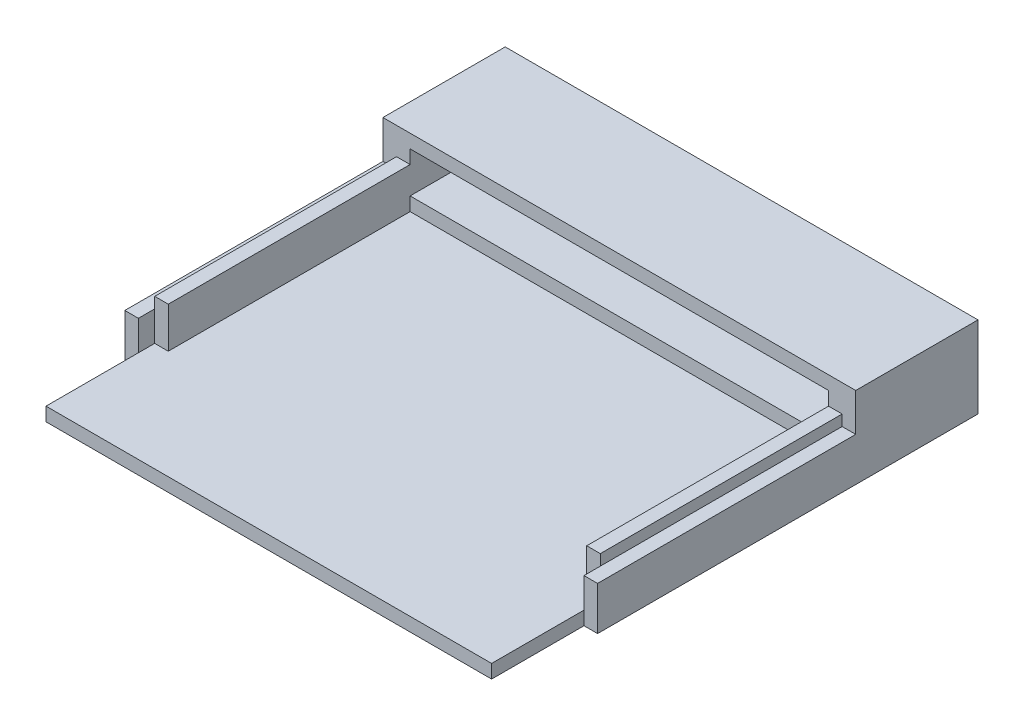
ISO-10303-21;
HEADER;
FILE_DESCRIPTION(('STEP AP214'),'2;1');
FILE_NAME('part.step','',(''),(''),'','','');
FILE_SCHEMA(('AUTOMOTIVE_DESIGN { 1 0 10303 214 1 1 1 1 }'));
ENDSEC;
DATA;
#1=APPLICATION_CONTEXT('core data for automotive mechanical design processes');
#2=APPLICATION_PROTOCOL_DEFINITION('international standard','automotive_design',2000,#1);
#3=PRODUCT_CONTEXT('',#1,'mechanical');
#4=PRODUCT('Part','Part','',(#3));
#5=PRODUCT_RELATED_PRODUCT_CATEGORY('part','',(#4));
#6=PRODUCT_DEFINITION_FORMATION('','',#4);
#7=PRODUCT_DEFINITION_CONTEXT('part definition',#1,'design');
#8=PRODUCT_DEFINITION('design','',#6,#7);
#9=PRODUCT_DEFINITION_SHAPE('','',#8);
#10=(LENGTH_UNIT() NAMED_UNIT(*) SI_UNIT(.MILLI.,.METRE.));
#11=(NAMED_UNIT(*) PLANE_ANGLE_UNIT() SI_UNIT($,.RADIAN.));
#12=(NAMED_UNIT(*) SI_UNIT($,.STERADIAN.) SOLID_ANGLE_UNIT());
#13=UNCERTAINTY_MEASURE_WITH_UNIT(LENGTH_MEASURE(1.E-05),#10,'distance_accuracy_value','');
#14=(GEOMETRIC_REPRESENTATION_CONTEXT(3) GLOBAL_UNCERTAINTY_ASSIGNED_CONTEXT((#13)) GLOBAL_UNIT_ASSIGNED_CONTEXT((#10,
#11,#12)) REPRESENTATION_CONTEXT('',''));
#15=CARTESIAN_POINT('',(0.,0.,0.));
#16=DIRECTION('',(0.,0.,1.));
#17=DIRECTION('',(1.,0.,0.));
#18=AXIS2_PLACEMENT_3D('',#15,#16,#17);
#19=CARTESIAN_POINT('',(159.,-5.,0.));
#20=DIRECTION('',(1.,0.,0.));
#21=DIRECTION('',(0.,0.,-1.));
#22=AXIS2_PLACEMENT_3D('',#19,#20,#21);
#23=PLANE('',#22);
#24=DIRECTION('',(0.,-1.,0.));
#25=VECTOR('',#24,1.);
#26=CARTESIAN_POINT('',(159.,11.,11.));
#27=LINE('',#26,#25);
#28=CARTESIAN_POINT('',(159.,0.,11.));
#29=VERTEX_POINT('',#28);
#30=CARTESIAN_POINT('',(159.,-5.,11.));
#31=VERTEX_POINT('',#30);
#32=EDGE_CURVE('E12',#29,#31,#27,.T.);
#33=ORIENTED_EDGE('',*,*,#32,.F.);
#34=DIRECTION('',(0.,0.,1.));
#35=VECTOR('',#34,1.);
#36=CARTESIAN_POINT('',(159.,0.,5.));
#37=LINE('',#36,#35);
#38=CARTESIAN_POINT('',(159.,0.,45.));
#39=VERTEX_POINT('',#38);
#40=EDGE_CURVE('E375',#29,#39,#37,.T.);
#41=ORIENTED_EDGE('',*,*,#40,.T.);
#42=DIRECTION('',(0.,1.,0.));
#43=VECTOR('',#42,1.);
#44=CARTESIAN_POINT('',(159.,0.,45.));
#45=LINE('',#44,#43);
#46=CARTESIAN_POINT('',(159.,-5.,45.));
#47=VERTEX_POINT('',#46);
#48=EDGE_CURVE('E240',#47,#39,#45,.T.);
#49=ORIENTED_EDGE('',*,*,#48,.F.);
#50=DIRECTION('',(0.,0.,-1.));
#51=VECTOR('',#50,1.);
#52=CARTESIAN_POINT('',(159.,-5.,0.));
#53=LINE('',#52,#51);
#54=EDGE_CURVE('E81',#47,#31,#53,.T.);
#55=ORIENTED_EDGE('',*,*,#54,.T.);
#56=EDGE_LOOP('',(#33,#41,#49,#55));
#57=FACE_BOUND('',#56,.T.);
#58=ADVANCED_FACE('F63',(#57),#23,.T.);
#59=CARTESIAN_POINT('',(-5.,-5.,0.));
#60=DIRECTION('',(1.,0.,0.));
#61=DIRECTION('',(0.,0.,-1.));
#62=AXIS2_PLACEMENT_3D('',#59,#60,#61);
#63=PLANE('',#62);
#64=DIRECTION('',(0.,0.,1.));
#65=VECTOR('',#64,1.);
#66=CARTESIAN_POINT('',(-5.,15.,0.));
#67=LINE('',#66,#65);
#68=CARTESIAN_POINT('',(-5.,15.,-84.));
#69=VERTEX_POINT('',#68);
#70=CARTESIAN_POINT('',(-5.,15.,5.));
#71=VERTEX_POINT('',#70);
#72=EDGE_CURVE('E364',#69,#71,#67,.T.);
#73=ORIENTED_EDGE('',*,*,#72,.F.);
#74=DIRECTION('',(0.,1.,0.));
#75=VECTOR('',#74,1.);
#76=CARTESIAN_POINT('',(-5.,3.92893218813452,-84.));
#77=LINE('',#76,#75);
#78=CARTESIAN_POINT('',(-5.,11.,-84.));
#79=VERTEX_POINT('',#78);
#80=EDGE_CURVE('E310',#79,#69,#77,.T.);
#81=ORIENTED_EDGE('',*,*,#80,.F.);
#82=DIRECTION('',(0.,0.,1.));
#83=VECTOR('',#82,1.);
#84=CARTESIAN_POINT('',(-5.,11.,-89.));
#85=LINE('',#84,#83);
#86=CARTESIAN_POINT('',(-5.,11.,5.));
#87=VERTEX_POINT('',#86);
#88=EDGE_CURVE('E341',#79,#87,#85,.T.);
#89=ORIENTED_EDGE('',*,*,#88,.T.);
#90=DIRECTION('',(0.,1.,0.));
#91=VECTOR('',#90,1.);
#92=CARTESIAN_POINT('',(-5.,-5.,5.));
#93=LINE('',#92,#91);
#94=EDGE_CURVE('E404',#87,#71,#93,.T.);
#95=ORIENTED_EDGE('',*,*,#94,.T.);
#96=EDGE_LOOP('',(#73,#81,#89,#95));
#97=FACE_BOUND('',#96,.T.);
#98=ADVANCED_FACE('F455',(#97),#63,.F.);
#99=CARTESIAN_POINT('',(0.,5.,0.));
#100=DIRECTION('',(0.,1.,0.));
#101=DIRECTION('',(0.,0.,1.));
#102=AXIS2_PLACEMENT_3D('',#99,#100,#101);
#103=PLANE('',#102);
#104=DIRECTION('',(1.,0.,0.));
#105=VECTOR('',#104,1.);
#106=CARTESIAN_POINT('',(0.,5.,-84.));
#107=LINE('',#106,#105);
#108=CARTESIAN_POINT('',(0.,5.,-84.));
#109=VERTEX_POINT('',#108);
#110=CARTESIAN_POINT('',(154.,5.,-84.));
#111=VERTEX_POINT('',#110);
#112=EDGE_CURVE('E381',#109,#111,#107,.T.);
#113=ORIENTED_EDGE('',*,*,#112,.T.);
#114=DIRECTION('',(0.,0.,1.));
#115=VECTOR('',#114,1.);
#116=CARTESIAN_POINT('',(154.,5.,0.));
#117=LINE('',#116,#115);
#118=CARTESIAN_POINT('',(154.,5.,-129.));
#119=VERTEX_POINT('',#118);
#120=EDGE_CURVE('E350',#119,#111,#117,.T.);
#121=ORIENTED_EDGE('',*,*,#120,.F.);
#122=DIRECTION('',(1.,0.,0.));
#123=VECTOR('',#122,1.);
#124=CARTESIAN_POINT('',(0.,5.,-129.));
#125=LINE('',#124,#123);
#126=CARTESIAN_POINT('',(0.,5.,-129.));
#127=VERTEX_POINT('',#126);
#128=EDGE_CURVE('E296',#127,#119,#125,.T.);
#129=ORIENTED_EDGE('',*,*,#128,.F.);
#130=DIRECTION('',(0.,0.,1.));
#131=VECTOR('',#130,1.);
#132=CARTESIAN_POINT('',(0.,5.,0.));
#133=LINE('',#132,#131);
#134=EDGE_CURVE('E360',#127,#109,#133,.T.);
#135=ORIENTED_EDGE('',*,*,#134,.T.);
#136=EDGE_LOOP('',(#113,#121,#129,#135));
#137=FACE_BOUND('',#136,.T.);
#138=ADVANCED_FACE('F496',(#137),#103,.T.);
#139=CARTESIAN_POINT('',(0.,-5.,5.));
#140=DIRECTION('',(0.,0.,1.));
#141=DIRECTION('',(1.,0.,0.));
#142=AXIS2_PLACEMENT_3D('',#139,#140,#141);
#143=PLANE('',#142);
#144=CARTESIAN_POINT('',(-5.,0.,5.));
#145=VERTEX_POINT('',#144);
#146=EDGE_CURVE('E402',#145,#87,#93,.T.);
#147=ORIENTED_EDGE('',*,*,#146,.F.);
#148=DIRECTION('',(1.,0.,0.));
#149=VECTOR('',#148,1.);
#150=CARTESIAN_POINT('',(-5.,0.,5.));
#151=LINE('',#150,#149);
#152=CARTESIAN_POINT('',(0.,0.,5.));
#153=VERTEX_POINT('',#152);
#154=EDGE_CURVE('E373',#145,#153,#151,.T.);
#155=ORIENTED_EDGE('',*,*,#154,.T.);
#156=DIRECTION('',(0.,-1.,0.));
#157=VECTOR('',#156,1.);
#158=CARTESIAN_POINT('',(0.,5.,5.));
#159=LINE('',#158,#157);
#160=CARTESIAN_POINT('',(0.,15.,5.));
#161=VERTEX_POINT('',#160);
#162=EDGE_CURVE('E396',#161,#153,#159,.T.);
#163=ORIENTED_EDGE('',*,*,#162,.F.);
#164=DIRECTION('',(1.,0.,0.));
#165=VECTOR('',#164,1.);
#166=CARTESIAN_POINT('',(0.,15.,5.));
#167=LINE('',#166,#165);
#168=EDGE_CURVE('E366',#71,#161,#167,.T.);
#169=ORIENTED_EDGE('',*,*,#168,.F.);
#170=ORIENTED_EDGE('',*,*,#94,.F.);
#171=EDGE_LOOP('',(#147,#155,#163,#169,#170));
#172=FACE_BOUND('',#171,.T.);
#173=ADVANCED_FACE('F65',(#172),#143,.T.);
#174=DIRECTION('',(0.,-1.,0.));
#175=VECTOR('',#174,1.);
#176=CARTESIAN_POINT('',(154.,5.,5.));
#177=LINE('',#176,#175);
#178=CARTESIAN_POINT('',(154.,15.,5.));
#179=VERTEX_POINT('',#178);
#180=CARTESIAN_POINT('',(154.,0.,5.));
#181=VERTEX_POINT('',#180);
#182=EDGE_CURVE('E399',#179,#181,#177,.T.);
#183=ORIENTED_EDGE('',*,*,#182,.T.);
#184=CARTESIAN_POINT('',(159.,0.,5.));
#185=VERTEX_POINT('',#184);
#186=EDGE_CURVE('E376',#181,#185,#151,.T.);
#187=ORIENTED_EDGE('',*,*,#186,.T.);
#188=DIRECTION('',(0.,1.,0.));
#189=VECTOR('',#188,1.);
#190=CARTESIAN_POINT('',(159.,-5.,5.));
#191=LINE('',#190,#189);
#192=CARTESIAN_POINT('',(159.,11.,5.));
#193=VERTEX_POINT('',#192);
#194=EDGE_CURVE('E67',#185,#193,#191,.T.);
#195=ORIENTED_EDGE('',*,*,#194,.T.);
#196=CARTESIAN_POINT('',(159.,15.,5.));
#197=VERTEX_POINT('',#196);
#198=EDGE_CURVE('E232',#193,#197,#191,.T.);
#199=ORIENTED_EDGE('',*,*,#198,.T.);
#200=DIRECTION('',(1.,0.,0.));
#201=VECTOR('',#200,1.);
#202=CARTESIAN_POINT('',(0.,15.,5.));
#203=LINE('',#202,#201);
#204=EDGE_CURVE('E354',#179,#197,#203,.T.);
#205=ORIENTED_EDGE('',*,*,#204,.F.);
#206=EDGE_LOOP('',(#183,#187,#195,#199,#205));
#207=FACE_BOUND('',#206,.T.);
#208=ADVANCED_FACE('F419',(#207),#143,.T.);
#209=CARTESIAN_POINT('',(0.,0.,0.));
#210=DIRECTION('',(0.,1.,0.));
#211=DIRECTION('',(0.,0.,1.));
#212=AXIS2_PLACEMENT_3D('',#209,#210,#211);
#213=PLANE('',#212);
#214=DIRECTION('',(0.,0.,1.));
#215=VECTOR('',#214,1.);
#216=CARTESIAN_POINT('',(0.,0.,0.));
#217=LINE('',#216,#215);
#218=CARTESIAN_POINT('',(0.,0.,-84.));
#219=VERTEX_POINT('',#218);
#220=EDGE_CURVE('E388',#219,#153,#217,.T.);
#221=ORIENTED_EDGE('',*,*,#220,.T.);
#222=ORIENTED_EDGE('',*,*,#154,.F.);
#223=DIRECTION('',(0.,0.,-1.));
#224=VECTOR('',#223,1.);
#225=CARTESIAN_POINT('',(-5.,0.,5.));
#226=LINE('',#225,#224);
#227=CARTESIAN_POINT('',(-5.,0.,11.));
#228=VERTEX_POINT('',#227);
#229=EDGE_CURVE('E369',#228,#145,#226,.T.);
#230=ORIENTED_EDGE('',*,*,#229,.F.);
#231=CARTESIAN_POINT('',(-5.,0.,45.));
#232=VERTEX_POINT('',#231);
#233=EDGE_CURVE('E371',#232,#228,#226,.T.);
#234=ORIENTED_EDGE('',*,*,#233,.F.);
#235=DIRECTION('',(-1.,0.,0.));
#236=VECTOR('',#235,1.);
#237=CARTESIAN_POINT('',(-5.,0.,45.));
#238=LINE('',#237,#236);
#239=EDGE_CURVE('E245',#39,#232,#238,.T.);
#240=ORIENTED_EDGE('',*,*,#239,.F.);
#241=ORIENTED_EDGE('',*,*,#40,.F.);
#242=EDGE_CURVE('E377',#185,#29,#37,.T.);
#243=ORIENTED_EDGE('',*,*,#242,.F.);
#244=ORIENTED_EDGE('',*,*,#186,.F.);
#245=DIRECTION('',(0.,0.,-1.));
#246=VECTOR('',#245,1.);
#247=CARTESIAN_POINT('',(154.,0.,0.));
#248=LINE('',#247,#246);
#249=CARTESIAN_POINT('',(154.,0.,-84.));
#250=VERTEX_POINT('',#249);
#251=EDGE_CURVE('E380',#181,#250,#248,.T.);
#252=ORIENTED_EDGE('',*,*,#251,.T.);
#253=DIRECTION('',(1.,0.,0.));
#254=VECTOR('',#253,1.);
#255=CARTESIAN_POINT('',(0.,0.,-84.));
#256=LINE('',#255,#254);
#257=EDGE_CURVE('E385',#219,#250,#256,.T.);
#258=ORIENTED_EDGE('',*,*,#257,.F.);
#259=EDGE_LOOP('',(#221,#222,#230,#234,#240,#241,#243,#244,#252,#258));
#260=FACE_BOUND('',#259,.T.);
#261=ADVANCED_FACE('F486',(#260),#213,.T.);
#262=ORIENTED_EDGE('',*,*,#233,.T.);
#263=DIRECTION('',(0.,-1.,0.));
#264=VECTOR('',#263,1.);
#265=CARTESIAN_POINT('',(-5.,11.,11.));
#266=LINE('',#265,#264);
#267=CARTESIAN_POINT('',(-5.,-5.,11.));
#268=VERTEX_POINT('',#267);
#269=EDGE_CURVE('E72',#228,#268,#266,.T.);
#270=ORIENTED_EDGE('',*,*,#269,.T.);
#271=DIRECTION('',(0.,0.,-1.));
#272=VECTOR('',#271,1.);
#273=CARTESIAN_POINT('',(-5.,-5.,0.));
#274=LINE('',#273,#272);
#275=CARTESIAN_POINT('',(-5.,-5.,45.));
#276=VERTEX_POINT('',#275);
#277=EDGE_CURVE('E224',#276,#268,#274,.T.);
#278=ORIENTED_EDGE('',*,*,#277,.F.);
#279=DIRECTION('',(0.,-1.,0.));
#280=VECTOR('',#279,1.);
#281=CARTESIAN_POINT('',(-5.,0.,45.));
#282=LINE('',#281,#280);
#283=EDGE_CURVE('E229',#232,#276,#282,.T.);
#284=ORIENTED_EDGE('',*,*,#283,.F.);
#285=EDGE_LOOP('',(#262,#270,#278,#284));
#286=FACE_BOUND('',#285,.T.);
#287=ADVANCED_FACE('F227',(#286),#63,.F.);
#288=DIRECTION('',(0.,1.,0.));
#289=VECTOR('',#288,1.);
#290=CARTESIAN_POINT('',(159.,3.92893218813452,-84.));
#291=LINE('',#290,#289);
#292=CARTESIAN_POINT('',(159.,11.,-84.));
#293=VERTEX_POINT('',#292);
#294=CARTESIAN_POINT('',(159.,15.,-84.));
#295=VERTEX_POINT('',#294);
#296=EDGE_CURVE('E307',#293,#295,#291,.T.);
#297=ORIENTED_EDGE('',*,*,#296,.T.);
#298=DIRECTION('',(0.,0.,-1.));
#299=VECTOR('',#298,1.);
#300=CARTESIAN_POINT('',(159.,15.,0.));
#301=LINE('',#300,#299);
#302=EDGE_CURVE('E357',#197,#295,#301,.T.);
#303=ORIENTED_EDGE('',*,*,#302,.F.);
#304=ORIENTED_EDGE('',*,*,#198,.F.);
#305=DIRECTION('',(0.,0.,1.));
#306=VECTOR('',#305,1.);
#307=CARTESIAN_POINT('',(159.,11.,-89.));
#308=LINE('',#307,#306);
#309=EDGE_CURVE('E328',#293,#193,#308,.T.);
#310=ORIENTED_EDGE('',*,*,#309,.F.);
#311=EDGE_LOOP('',(#297,#303,#304,#310));
#312=FACE_BOUND('',#311,.T.);
#313=ADVANCED_FACE('F429',(#312),#23,.T.);
#314=CARTESIAN_POINT('',(0.,-5.,0.));
#315=DIRECTION('',(0.,1.,0.));
#316=DIRECTION('',(0.,0.,1.));
#317=AXIS2_PLACEMENT_3D('',#314,#315,#316);
#318=PLANE('',#317);
#319=ORIENTED_EDGE('',*,*,#54,.F.);
#320=DIRECTION('',(1.,0.,0.));
#321=VECTOR('',#320,1.);
#322=CARTESIAN_POINT('',(-5.,-5.,45.));
#323=LINE('',#322,#321);
#324=EDGE_CURVE('E235',#276,#47,#323,.T.);
#325=ORIENTED_EDGE('',*,*,#324,.F.);
#326=ORIENTED_EDGE('',*,*,#277,.T.);
#327=DIRECTION('',(-1.,0.,0.));
#328=VECTOR('',#327,1.);
#329=CARTESIAN_POINT('',(-5.,-5.,11.));
#330=LINE('',#329,#328);
#331=CARTESIAN_POINT('',(-10.,-5.,11.));
#332=VERTEX_POINT('',#331);
#333=EDGE_CURVE('E327',#268,#332,#330,.T.);
#334=ORIENTED_EDGE('',*,*,#333,.T.);
#335=DIRECTION('',(0.,0.,1.));
#336=VECTOR('',#335,1.);
#337=CARTESIAN_POINT('',(-10.,-5.,-89.));
#338=LINE('',#337,#336);
#339=CARTESIAN_POINT('',(-10.,-5.,-129.));
#340=VERTEX_POINT('',#339);
#341=EDGE_CURVE('E338',#340,#332,#338,.T.);
#342=ORIENTED_EDGE('',*,*,#341,.F.);
#343=DIRECTION('',(-1.,0.,0.));
#344=VECTOR('',#343,1.);
#345=CARTESIAN_POINT('',(0.,-5.,-129.));
#346=LINE('',#345,#344);
#347=CARTESIAN_POINT('',(164.,-5.,-129.));
#348=VERTEX_POINT('',#347);
#349=EDGE_CURVE('E304',#348,#340,#346,.T.);
#350=ORIENTED_EDGE('',*,*,#349,.F.);
#351=DIRECTION('',(0.,0.,1.));
#352=VECTOR('',#351,1.);
#353=CARTESIAN_POINT('',(164.,-5.,-89.));
#354=LINE('',#353,#352);
#355=CARTESIAN_POINT('',(164.,-5.,11.));
#356=VERTEX_POINT('',#355);
#357=EDGE_CURVE('E320',#348,#356,#354,.T.);
#358=ORIENTED_EDGE('',*,*,#357,.T.);
#359=DIRECTION('',(1.,0.,0.));
#360=VECTOR('',#359,1.);
#361=CARTESIAN_POINT('',(159.,-5.,11.));
#362=LINE('',#361,#360);
#363=EDGE_CURVE('E323',#31,#356,#362,.T.);
#364=ORIENTED_EDGE('',*,*,#363,.F.);
#365=EDGE_LOOP('',(#319,#325,#326,#334,#342,#350,#358,#364));
#366=FACE_BOUND('',#365,.T.);
#367=ADVANCED_FACE('F236',(#366),#318,.F.);
#368=CARTESIAN_POINT('',(154.,5.,0.));
#369=DIRECTION('',(-1.,0.,0.));
#370=DIRECTION('',(0.,0.,1.));
#371=AXIS2_PLACEMENT_3D('',#368,#369,#370);
#372=PLANE('',#371);
#373=DIRECTION('',(0.,0.,-1.));
#374=VECTOR('',#373,1.);
#375=CARTESIAN_POINT('',(154.,20.,90.5623097922344));
#376=LINE('',#375,#374);
#377=CARTESIAN_POINT('',(154.,20.,-84.));
#378=VERTEX_POINT('',#377);
#379=CARTESIAN_POINT('',(154.,20.,-129.));
#380=VERTEX_POINT('',#379);
#381=EDGE_CURVE('E268',#378,#380,#376,.T.);
#382=ORIENTED_EDGE('',*,*,#381,.T.);
#383=DIRECTION('',(0.,1.,0.));
#384=VECTOR('',#383,1.);
#385=CARTESIAN_POINT('',(154.,0.,-129.));
#386=LINE('',#385,#384);
#387=EDGE_CURVE('E299',#119,#380,#386,.T.);
#388=ORIENTED_EDGE('',*,*,#387,.F.);
#389=ORIENTED_EDGE('',*,*,#120,.T.);
#390=DIRECTION('',(0.,-1.,0.));
#391=VECTOR('',#390,1.);
#392=CARTESIAN_POINT('',(154.,5.,-84.));
#393=LINE('',#392,#391);
#394=EDGE_CURVE('E384',#111,#250,#393,.T.);
#395=ORIENTED_EDGE('',*,*,#394,.T.);
#396=ORIENTED_EDGE('',*,*,#251,.F.);
#397=ORIENTED_EDGE('',*,*,#182,.F.);
#398=DIRECTION('',(0.,0.,1.));
#399=VECTOR('',#398,1.);
#400=CARTESIAN_POINT('',(154.,15.,0.));
#401=LINE('',#400,#399);
#402=CARTESIAN_POINT('',(154.,15.,-84.));
#403=VERTEX_POINT('',#402);
#404=EDGE_CURVE('E352',#403,#179,#401,.T.);
#405=ORIENTED_EDGE('',*,*,#404,.F.);
#406=DIRECTION('',(0.,1.,0.));
#407=VECTOR('',#406,1.);
#408=CARTESIAN_POINT('',(154.,11.,-84.));
#409=LINE('',#408,#407);
#410=EDGE_CURVE('E269',#403,#378,#409,.T.);
#411=ORIENTED_EDGE('',*,*,#410,.T.);
#412=EDGE_LOOP('',(#382,#388,#389,#395,#396,#397,#405,#411));
#413=FACE_BOUND('',#412,.T.);
#414=ADVANCED_FACE('F469',(#413),#372,.T.);
#415=CARTESIAN_POINT('',(0.,5.,0.));
#416=DIRECTION('',(1.,0.,0.));
#417=DIRECTION('',(0.,0.,-1.));
#418=AXIS2_PLACEMENT_3D('',#415,#416,#417);
#419=PLANE('',#418);
#420=DIRECTION('',(0.,-1.,0.));
#421=VECTOR('',#420,1.);
#422=CARTESIAN_POINT('',(0.,0.,-129.));
#423=LINE('',#422,#421);
#424=CARTESIAN_POINT('',(0.,20.,-129.));
#425=VERTEX_POINT('',#424);
#426=EDGE_CURVE('E293',#425,#127,#423,.T.);
#427=ORIENTED_EDGE('',*,*,#426,.F.);
#428=DIRECTION('',(0.,0.,-1.));
#429=VECTOR('',#428,1.);
#430=CARTESIAN_POINT('',(0.,20.,90.5623097922344));
#431=LINE('',#430,#429);
#432=CARTESIAN_POINT('',(0.,20.,-84.));
#433=VERTEX_POINT('',#432);
#434=EDGE_CURVE('E264',#433,#425,#431,.T.);
#435=ORIENTED_EDGE('',*,*,#434,.F.);
#436=DIRECTION('',(0.,-1.,0.));
#437=VECTOR('',#436,1.);
#438=CARTESIAN_POINT('',(0.,11.,-84.));
#439=LINE('',#438,#437);
#440=CARTESIAN_POINT('',(0.,15.,-84.));
#441=VERTEX_POINT('',#440);
#442=EDGE_CURVE('E260',#433,#441,#439,.T.);
#443=ORIENTED_EDGE('',*,*,#442,.T.);
#444=DIRECTION('',(0.,0.,1.));
#445=VECTOR('',#444,1.);
#446=CARTESIAN_POINT('',(0.,15.,0.));
#447=LINE('',#446,#445);
#448=EDGE_CURVE('E362',#441,#161,#447,.T.);
#449=ORIENTED_EDGE('',*,*,#448,.T.);
#450=ORIENTED_EDGE('',*,*,#162,.T.);
#451=ORIENTED_EDGE('',*,*,#220,.F.);
#452=DIRECTION('',(0.,-1.,0.));
#453=VECTOR('',#452,1.);
#454=CARTESIAN_POINT('',(0.,5.,-84.));
#455=LINE('',#454,#453);
#456=EDGE_CURVE('E394',#109,#219,#455,.T.);
#457=ORIENTED_EDGE('',*,*,#456,.F.);
#458=ORIENTED_EDGE('',*,*,#134,.F.);
#459=EDGE_LOOP('',(#427,#435,#443,#449,#450,#451,#457,#458));
#460=FACE_BOUND('',#459,.T.);
#461=ADVANCED_FACE('F462',(#460),#419,.T.);
#462=CARTESIAN_POINT('',(0.,5.,-84.));
#463=DIRECTION('',(0.,0.,-1.));
#464=DIRECTION('',(-1.,0.,0.));
#465=AXIS2_PLACEMENT_3D('',#462,#463,#464);
#466=PLANE('',#465);
#467=ORIENTED_EDGE('',*,*,#257,.T.);
#468=ORIENTED_EDGE('',*,*,#394,.F.);
#469=ORIENTED_EDGE('',*,*,#112,.F.);
#470=ORIENTED_EDGE('',*,*,#456,.T.);
#471=EDGE_LOOP('',(#467,#468,#469,#470));
#472=FACE_BOUND('',#471,.T.);
#473=ADVANCED_FACE('F494',(#472),#466,.F.);
#474=CARTESIAN_POINT('',(0.,15.,0.));
#475=DIRECTION('',(0.,1.,0.));
#476=DIRECTION('',(0.,0.,1.));
#477=AXIS2_PLACEMENT_3D('',#474,#475,#476);
#478=PLANE('',#477);
#479=DIRECTION('',(1.,0.,0.));
#480=VECTOR('',#479,1.);
#481=CARTESIAN_POINT('',(-5.,15.,-84.));
#482=LINE('',#481,#480);
#483=EDGE_CURVE('E308',#69,#441,#482,.T.);
#484=ORIENTED_EDGE('',*,*,#483,.F.);
#485=ORIENTED_EDGE('',*,*,#72,.T.);
#486=ORIENTED_EDGE('',*,*,#168,.T.);
#487=ORIENTED_EDGE('',*,*,#448,.F.);
#488=EDGE_LOOP('',(#484,#485,#486,#487));
#489=FACE_BOUND('',#488,.T.);
#490=ADVANCED_FACE('F457',(#489),#478,.T.);
#491=CARTESIAN_POINT('',(0.,15.,0.));
#492=DIRECTION('',(0.,1.,0.));
#493=DIRECTION('',(0.,0.,1.));
#494=AXIS2_PLACEMENT_3D('',#491,#492,#493);
#495=PLANE('',#494);
#496=DIRECTION('',(1.,0.,0.));
#497=VECTOR('',#496,1.);
#498=CARTESIAN_POINT('',(154.,15.,-84.));
#499=LINE('',#498,#497);
#500=EDGE_CURVE('E311',#403,#295,#499,.T.);
#501=ORIENTED_EDGE('',*,*,#500,.F.);
#502=ORIENTED_EDGE('',*,*,#404,.T.);
#503=ORIENTED_EDGE('',*,*,#204,.T.);
#504=ORIENTED_EDGE('',*,*,#302,.T.);
#505=EDGE_LOOP('',(#501,#502,#503,#504));
#506=FACE_BOUND('',#505,.T.);
#507=ADVANCED_FACE('F426',(#506),#495,.T.);
#508=CARTESIAN_POINT('',(-5.,11.,11.));
#509=DIRECTION('',(0.,0.,1.));
#510=DIRECTION('',(1.,0.,0.));
#511=AXIS2_PLACEMENT_3D('',#508,#509,#510);
#512=PLANE('',#511);
#513=ORIENTED_EDGE('',*,*,#333,.F.);
#514=ORIENTED_EDGE('',*,*,#269,.F.);
#515=CARTESIAN_POINT('',(-5.,11.,11.));
#516=VERTEX_POINT('',#515);
#517=EDGE_CURVE('E347',#516,#228,#266,.T.);
#518=ORIENTED_EDGE('',*,*,#517,.F.);
#519=DIRECTION('',(-1.,0.,0.));
#520=VECTOR('',#519,1.);
#521=CARTESIAN_POINT('',(-5.,11.,11.));
#522=LINE('',#521,#520);
#523=CARTESIAN_POINT('',(-10.,11.,11.));
#524=VERTEX_POINT('',#523);
#525=EDGE_CURVE('E334',#516,#524,#522,.T.);
#526=ORIENTED_EDGE('',*,*,#525,.T.);
#527=DIRECTION('',(0.,-1.,0.));
#528=VECTOR('',#527,1.);
#529=CARTESIAN_POINT('',(-10.,11.,11.));
#530=LINE('',#529,#528);
#531=EDGE_CURVE('E343',#524,#332,#530,.T.);
#532=ORIENTED_EDGE('',*,*,#531,.T.);
#533=EDGE_LOOP('',(#513,#514,#518,#526,#532));
#534=FACE_BOUND('',#533,.T.);
#535=ADVANCED_FACE('F481',(#534),#512,.T.);
#536=CARTESIAN_POINT('',(-5.,11.,-89.));
#537=DIRECTION('',(1.,0.,0.));
#538=DIRECTION('',(0.,0.,-1.));
#539=AXIS2_PLACEMENT_3D('',#536,#537,#538);
#540=PLANE('',#539);
#541=ORIENTED_EDGE('',*,*,#517,.T.);
#542=ORIENTED_EDGE('',*,*,#229,.T.);
#543=ORIENTED_EDGE('',*,*,#146,.T.);
#544=EDGE_CURVE('E340',#87,#516,#85,.T.);
#545=ORIENTED_EDGE('',*,*,#544,.T.);
#546=EDGE_LOOP('',(#541,#542,#543,#545));
#547=FACE_BOUND('',#546,.T.);
#548=ADVANCED_FACE('F484',(#547),#540,.T.);
#549=CARTESIAN_POINT('',(-10.,11.,-89.));
#550=DIRECTION('',(1.,0.,0.));
#551=DIRECTION('',(0.,0.,-1.));
#552=AXIS2_PLACEMENT_3D('',#549,#550,#551);
#553=PLANE('',#552);
#554=ORIENTED_EDGE('',*,*,#341,.T.);
#555=ORIENTED_EDGE('',*,*,#531,.F.);
#556=DIRECTION('',(0.,0.,1.));
#557=VECTOR('',#556,1.);
#558=CARTESIAN_POINT('',(-10.,11.,-89.));
#559=LINE('',#558,#557);
#560=CARTESIAN_POINT('',(-10.,11.,-84.));
#561=VERTEX_POINT('',#560);
#562=EDGE_CURVE('E337',#561,#524,#559,.T.);
#563=ORIENTED_EDGE('',*,*,#562,.F.);
#564=DIRECTION('',(0.,1.,0.));
#565=VECTOR('',#564,1.);
#566=CARTESIAN_POINT('',(-10.,11.,-84.));
#567=LINE('',#566,#565);
#568=CARTESIAN_POINT('',(-10.,25.,-84.));
#569=VERTEX_POINT('',#568);
#570=EDGE_CURVE('E259',#561,#569,#567,.T.);
#571=ORIENTED_EDGE('',*,*,#570,.T.);
#572=DIRECTION('',(0.,0.,-1.));
#573=VECTOR('',#572,1.);
#574=CARTESIAN_POINT('',(-10.,25.,90.5623097922344));
#575=LINE('',#574,#573);
#576=CARTESIAN_POINT('',(-10.,25.,-129.));
#577=VERTEX_POINT('',#576);
#578=EDGE_CURVE('E281',#569,#577,#575,.T.);
#579=ORIENTED_EDGE('',*,*,#578,.T.);
#580=DIRECTION('',(0.,1.,0.));
#581=VECTOR('',#580,1.);
#582=CARTESIAN_POINT('',(-10.,0.,-129.));
#583=LINE('',#582,#581);
#584=EDGE_CURVE('E263',#340,#577,#583,.T.);
#585=ORIENTED_EDGE('',*,*,#584,.F.);
#586=EDGE_LOOP('',(#554,#555,#563,#571,#579,#585));
#587=FACE_BOUND('',#586,.T.);
#588=ADVANCED_FACE('F447',(#587),#553,.F.);
#589=CARTESIAN_POINT('',(0.,11.,0.));
#590=DIRECTION('',(0.,1.,0.));
#591=DIRECTION('',(0.,0.,1.));
#592=AXIS2_PLACEMENT_3D('',#589,#590,#591);
#593=PLANE('',#592);
#594=DIRECTION('',(-1.,0.,0.));
#595=VECTOR('',#594,1.);
#596=CARTESIAN_POINT('',(-10.,11.,-84.));
#597=LINE('',#596,#595);
#598=EDGE_CURVE('E254',#79,#561,#597,.T.);
#599=ORIENTED_EDGE('',*,*,#598,.T.);
#600=ORIENTED_EDGE('',*,*,#562,.T.);
#601=ORIENTED_EDGE('',*,*,#525,.F.);
#602=ORIENTED_EDGE('',*,*,#544,.F.);
#603=ORIENTED_EDGE('',*,*,#88,.F.);
#604=EDGE_LOOP('',(#599,#600,#601,#602,#603));
#605=FACE_BOUND('',#604,.T.);
#606=ADVANCED_FACE('F451',(#605),#593,.T.);
#607=CARTESIAN_POINT('',(159.,11.,11.));
#608=DIRECTION('',(0.,0.,-1.));
#609=DIRECTION('',(-1.,0.,0.));
#610=AXIS2_PLACEMENT_3D('',#607,#608,#609);
#611=PLANE('',#610);
#612=ORIENTED_EDGE('',*,*,#363,.T.);
#613=DIRECTION('',(0.,-1.,0.));
#614=VECTOR('',#613,1.);
#615=CARTESIAN_POINT('',(164.,11.,11.));
#616=LINE('',#615,#614);
#617=CARTESIAN_POINT('',(164.,11.,11.));
#618=VERTEX_POINT('',#617);
#619=EDGE_CURVE('E313',#618,#356,#616,.T.);
#620=ORIENTED_EDGE('',*,*,#619,.F.);
#621=DIRECTION('',(1.,0.,0.));
#622=VECTOR('',#621,1.);
#623=CARTESIAN_POINT('',(159.,11.,11.));
#624=LINE('',#623,#622);
#625=CARTESIAN_POINT('',(159.,11.,11.));
#626=VERTEX_POINT('',#625);
#627=EDGE_CURVE('E324',#626,#618,#624,.T.);
#628=ORIENTED_EDGE('',*,*,#627,.F.);
#629=EDGE_CURVE('E74',#626,#29,#27,.T.);
#630=ORIENTED_EDGE('',*,*,#629,.T.);
#631=ORIENTED_EDGE('',*,*,#32,.T.);
#632=EDGE_LOOP('',(#612,#620,#628,#630,#631));
#633=FACE_BOUND('',#632,.T.);
#634=ADVANCED_FACE('F476',(#633),#611,.F.);
#635=CARTESIAN_POINT('',(164.,11.,-89.));
#636=DIRECTION('',(1.,0.,0.));
#637=DIRECTION('',(0.,0.,-1.));
#638=AXIS2_PLACEMENT_3D('',#635,#636,#637);
#639=PLANE('',#638);
#640=ORIENTED_EDGE('',*,*,#357,.F.);
#641=DIRECTION('',(0.,-1.,0.));
#642=VECTOR('',#641,1.);
#643=CARTESIAN_POINT('',(164.,0.,-129.));
#644=LINE('',#643,#642);
#645=CARTESIAN_POINT('',(164.,25.,-129.));
#646=VERTEX_POINT('',#645);
#647=EDGE_CURVE('E301',#646,#348,#644,.T.);
#648=ORIENTED_EDGE('',*,*,#647,.F.);
#649=DIRECTION('',(0.,0.,-1.));
#650=VECTOR('',#649,1.);
#651=CARTESIAN_POINT('',(164.,25.,90.5623097922344));
#652=LINE('',#651,#650);
#653=CARTESIAN_POINT('',(164.,25.,-84.));
#654=VERTEX_POINT('',#653);
#655=EDGE_CURVE('E277',#654,#646,#652,.T.);
#656=ORIENTED_EDGE('',*,*,#655,.F.);
#657=DIRECTION('',(0.,-1.,0.));
#658=VECTOR('',#657,1.);
#659=CARTESIAN_POINT('',(164.,11.,-84.));
#660=LINE('',#659,#658);
#661=CARTESIAN_POINT('',(164.,11.,-84.));
#662=VERTEX_POINT('',#661);
#663=EDGE_CURVE('E274',#654,#662,#660,.T.);
#664=ORIENTED_EDGE('',*,*,#663,.T.);
#665=DIRECTION('',(0.,0.,1.));
#666=VECTOR('',#665,1.);
#667=CARTESIAN_POINT('',(164.,11.,-89.));
#668=LINE('',#667,#666);
#669=EDGE_CURVE('E330',#662,#618,#668,.T.);
#670=ORIENTED_EDGE('',*,*,#669,.T.);
#671=ORIENTED_EDGE('',*,*,#619,.T.);
#672=EDGE_LOOP('',(#640,#648,#656,#664,#670,#671));
#673=FACE_BOUND('',#672,.T.);
#674=ADVANCED_FACE('F438',(#673),#639,.T.);
#675=CARTESIAN_POINT('',(159.,11.,-89.));
#676=DIRECTION('',(1.,0.,0.));
#677=DIRECTION('',(0.,0.,-1.));
#678=AXIS2_PLACEMENT_3D('',#675,#676,#677);
#679=PLANE('',#678);
#680=ORIENTED_EDGE('',*,*,#194,.F.);
#681=ORIENTED_EDGE('',*,*,#242,.T.);
#682=ORIENTED_EDGE('',*,*,#629,.F.);
#683=EDGE_CURVE('E319',#193,#626,#308,.T.);
#684=ORIENTED_EDGE('',*,*,#683,.F.);
#685=EDGE_LOOP('',(#680,#681,#682,#684));
#686=FACE_BOUND('',#685,.T.);
#687=ADVANCED_FACE('F473',(#686),#679,.F.);
#688=CARTESIAN_POINT('',(0.,11.,0.));
#689=DIRECTION('',(0.,-1.,0.));
#690=DIRECTION('',(0.,0.,-1.));
#691=AXIS2_PLACEMENT_3D('',#688,#689,#690);
#692=PLANE('',#691);
#693=ORIENTED_EDGE('',*,*,#669,.F.);
#694=DIRECTION('',(-1.,0.,0.));
#695=VECTOR('',#694,1.);
#696=CARTESIAN_POINT('',(164.,11.,-84.));
#697=LINE('',#696,#695);
#698=EDGE_CURVE('E271',#662,#293,#697,.T.);
#699=ORIENTED_EDGE('',*,*,#698,.T.);
#700=ORIENTED_EDGE('',*,*,#309,.T.);
#701=ORIENTED_EDGE('',*,*,#683,.T.);
#702=ORIENTED_EDGE('',*,*,#627,.T.);
#703=EDGE_LOOP('',(#693,#699,#700,#701,#702));
#704=FACE_BOUND('',#703,.T.);
#705=ADVANCED_FACE('F434',(#704),#692,.F.);
#706=CARTESIAN_POINT('',(0.,0.,-129.));
#707=DIRECTION('',(0.,0.,-1.));
#708=DIRECTION('',(-1.,0.,0.));
#709=AXIS2_PLACEMENT_3D('',#706,#707,#708);
#710=PLANE('',#709);
#711=DIRECTION('',(-1.,0.,0.));
#712=VECTOR('',#711,1.);
#713=CARTESIAN_POINT('',(154.,20.,-129.));
#714=LINE('',#713,#712);
#715=EDGE_CURVE('E251',#380,#425,#714,.T.);
#716=ORIENTED_EDGE('',*,*,#715,.T.);
#717=ORIENTED_EDGE('',*,*,#426,.T.);
#718=ORIENTED_EDGE('',*,*,#128,.T.);
#719=ORIENTED_EDGE('',*,*,#387,.T.);
#720=EDGE_LOOP('',(#716,#717,#718,#719));
#721=FACE_BOUND('',#720,.T.);
#722=ORIENTED_EDGE('',*,*,#584,.T.);
#723=DIRECTION('',(1.,0.,0.));
#724=VECTOR('',#723,1.);
#725=CARTESIAN_POINT('',(164.,25.,-129.));
#726=LINE('',#725,#724);
#727=EDGE_CURVE('E250',#577,#646,#726,.T.);
#728=ORIENTED_EDGE('',*,*,#727,.T.);
#729=ORIENTED_EDGE('',*,*,#647,.T.);
#730=ORIENTED_EDGE('',*,*,#349,.T.);
#731=EDGE_LOOP('',(#722,#728,#729,#730));
#732=FACE_BOUND('',#731,.T.);
#733=ADVANCED_FACE('F479',(#721,#732),#710,.T.);
#734=CARTESIAN_POINT('',(154.,3.92893218813452,-84.));
#735=DIRECTION('',(0.,0.,1.));
#736=DIRECTION('',(1.,0.,0.));
#737=AXIS2_PLACEMENT_3D('',#734,#735,#736);
#738=PLANE('',#737);
#739=ORIENTED_EDGE('',*,*,#80,.T.);
#740=ORIENTED_EDGE('',*,*,#483,.T.);
#741=ORIENTED_EDGE('',*,*,#442,.F.);
#742=DIRECTION('',(-1.,0.,0.));
#743=VECTOR('',#742,1.);
#744=CARTESIAN_POINT('',(154.,20.,-84.));
#745=LINE('',#744,#743);
#746=EDGE_CURVE('E265',#378,#433,#745,.T.);
#747=ORIENTED_EDGE('',*,*,#746,.F.);
#748=ORIENTED_EDGE('',*,*,#410,.F.);
#749=ORIENTED_EDGE('',*,*,#500,.T.);
#750=ORIENTED_EDGE('',*,*,#296,.F.);
#751=ORIENTED_EDGE('',*,*,#698,.F.);
#752=ORIENTED_EDGE('',*,*,#663,.F.);
#753=DIRECTION('',(1.,0.,0.));
#754=VECTOR('',#753,1.);
#755=CARTESIAN_POINT('',(164.,25.,-84.));
#756=LINE('',#755,#754);
#757=EDGE_CURVE('E278',#569,#654,#756,.T.);
#758=ORIENTED_EDGE('',*,*,#757,.F.);
#759=ORIENTED_EDGE('',*,*,#570,.F.);
#760=ORIENTED_EDGE('',*,*,#598,.F.);
#761=EDGE_LOOP('',(#739,#740,#741,#747,#748,#749,#750,#751,#752,#758,#759,#760));
#762=FACE_BOUND('',#761,.T.);
#763=ADVANCED_FACE('F431',(#762),#738,.T.);
#764=CARTESIAN_POINT('',(164.,25.,90.5623097922344));
#765=DIRECTION('',(0.,1.,0.));
#766=DIRECTION('',(0.,0.,1.));
#767=AXIS2_PLACEMENT_3D('',#764,#765,#766);
#768=PLANE('',#767);
#769=ORIENTED_EDGE('',*,*,#578,.F.);
#770=ORIENTED_EDGE('',*,*,#757,.T.);
#771=ORIENTED_EDGE('',*,*,#655,.T.);
#772=ORIENTED_EDGE('',*,*,#727,.F.);
#773=EDGE_LOOP('',(#769,#770,#771,#772));
#774=FACE_BOUND('',#773,.T.);
#775=ADVANCED_FACE('F443',(#774),#768,.T.);
#776=CARTESIAN_POINT('',(154.,20.,90.5623097922344));
#777=DIRECTION('',(0.,-1.,0.));
#778=DIRECTION('',(0.,0.,-1.));
#779=AXIS2_PLACEMENT_3D('',#776,#777,#778);
#780=PLANE('',#779);
#781=ORIENTED_EDGE('',*,*,#381,.F.);
#782=ORIENTED_EDGE('',*,*,#746,.T.);
#783=ORIENTED_EDGE('',*,*,#434,.T.);
#784=ORIENTED_EDGE('',*,*,#715,.F.);
#785=EDGE_LOOP('',(#781,#782,#783,#784));
#786=FACE_BOUND('',#785,.T.);
#787=ADVANCED_FACE('F467',(#786),#780,.T.);
#788=CARTESIAN_POINT('',(0.,0.,45.));
#789=DIRECTION('',(0.,0.,1.));
#790=DIRECTION('',(1.,0.,0.));
#791=AXIS2_PLACEMENT_3D('',#788,#789,#790);
#792=PLANE('',#791);
#793=ORIENTED_EDGE('',*,*,#283,.T.);
#794=ORIENTED_EDGE('',*,*,#324,.T.);
#795=ORIENTED_EDGE('',*,*,#48,.T.);
#796=ORIENTED_EDGE('',*,*,#239,.T.);
#797=EDGE_LOOP('',(#793,#794,#795,#796));
#798=FACE_BOUND('',#797,.T.);
#799=ADVANCED_FACE('F243',(#798),#792,.T.);
#800=CLOSED_SHELL('',(#58,#98,#138,#173,#208,#261,#287,#313,#367,#414,#461,#473,#490,#507,#535,
#548,#588,#606,#634,#674,#687,#705,#733,#763,#775,#787,#799));
#801=MANIFOLD_SOLID_BREP('B2',#800);
#802=ADVANCED_BREP_SHAPE_REPRESENTATION('',(#18,#801),#14);
#803=SHAPE_DEFINITION_REPRESENTATION(#9,#802);
ENDSEC;
END-ISO-10303-21;
